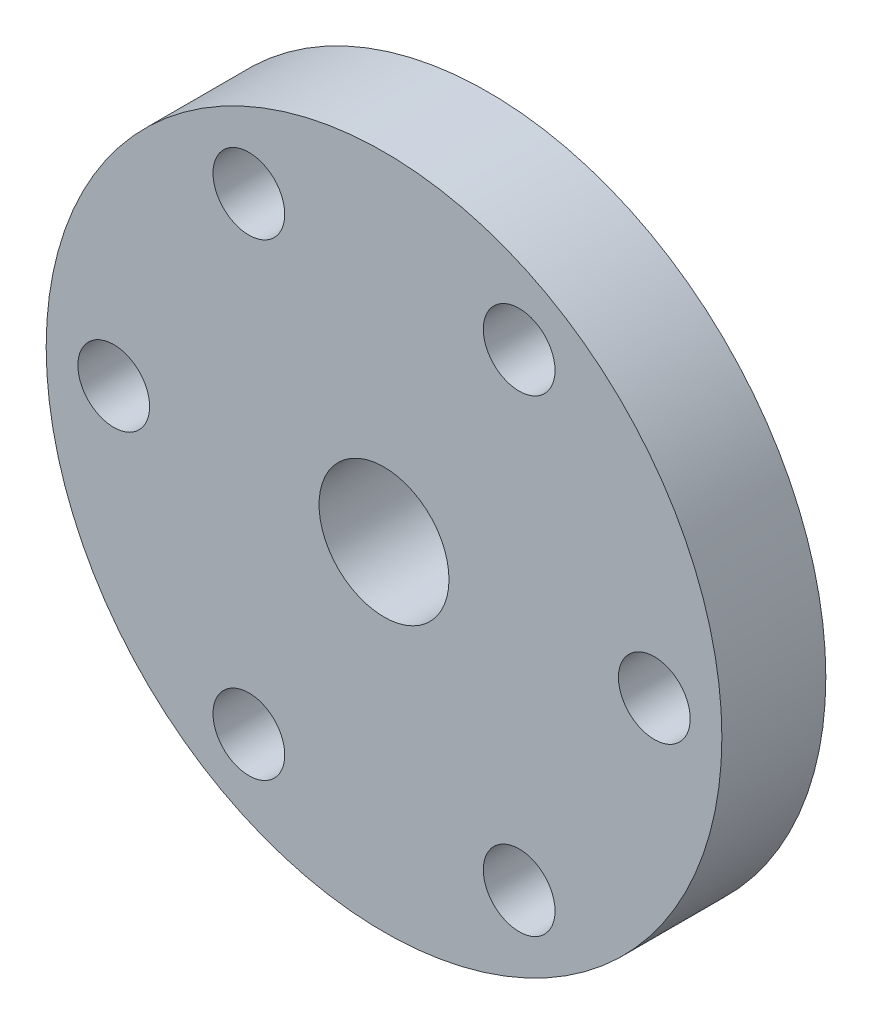
ISO-10303-21;
HEADER;
FILE_DESCRIPTION(('STEP AP214'),'2;1');
FILE_NAME('part.step','',(''),(''),'','','');
FILE_SCHEMA(('AUTOMOTIVE_DESIGN { 1 0 10303 214 1 1 1 1 }'));
ENDSEC;
DATA;
#1=APPLICATION_CONTEXT('core data for automotive mechanical design processes');
#2=APPLICATION_PROTOCOL_DEFINITION('international standard','automotive_design',2000,#1);
#3=PRODUCT_CONTEXT('',#1,'mechanical');
#4=PRODUCT('Part','Part','',(#3));
#5=PRODUCT_RELATED_PRODUCT_CATEGORY('part','',(#4));
#6=PRODUCT_DEFINITION_FORMATION('','',#4);
#7=PRODUCT_DEFINITION_CONTEXT('part definition',#1,'design');
#8=PRODUCT_DEFINITION('design','',#6,#7);
#9=PRODUCT_DEFINITION_SHAPE('','',#8);
#10=(LENGTH_UNIT() NAMED_UNIT(*) SI_UNIT(.MILLI.,.METRE.));
#11=(NAMED_UNIT(*) PLANE_ANGLE_UNIT() SI_UNIT($,.RADIAN.));
#12=(NAMED_UNIT(*) SI_UNIT($,.STERADIAN.) SOLID_ANGLE_UNIT());
#13=UNCERTAINTY_MEASURE_WITH_UNIT(LENGTH_MEASURE(1.E-05),#10,'distance_accuracy_value','');
#14=(GEOMETRIC_REPRESENTATION_CONTEXT(3) GLOBAL_UNCERTAINTY_ASSIGNED_CONTEXT((#13)) GLOBAL_UNIT_ASSIGNED_CONTEXT((#10,
#11,#12)) REPRESENTATION_CONTEXT('',''));
#15=CARTESIAN_POINT('',(0.,0.,0.));
#16=DIRECTION('',(0.,0.,1.));
#17=DIRECTION('',(1.,0.,0.));
#18=AXIS2_PLACEMENT_3D('',#15,#16,#17);
#19=CARTESIAN_POINT('',(0.,0.,5.08));
#20=DIRECTION('',(0.,0.,-1.));
#21=DIRECTION('',(-1.,0.,0.));
#22=AXIS2_PLACEMENT_3D('',#19,#20,#21);
#23=CYLINDRICAL_SURFACE('',#22,16.51);
#24=CARTESIAN_POINT('',(0.,0.,5.08));
#25=DIRECTION('',(0.,0.,1.));
#26=DIRECTION('',(1.,0.,0.));
#27=AXIS2_PLACEMENT_3D('',#24,#25,#26);
#28=CIRCLE('',#27,16.51);
#29=CARTESIAN_POINT('',(16.51,0.,5.08));
#30=VERTEX_POINT('',#29);
#31=EDGE_CURVE('E10',#30,#30,#28,.T.);
#32=ORIENTED_EDGE('',*,*,#31,.F.);
#33=EDGE_LOOP('',(#32));
#34=FACE_BOUND('',#33,.T.);
#35=CARTESIAN_POINT('',(0.,0.,0.));
#36=DIRECTION('',(0.,0.,1.));
#37=DIRECTION('',(1.,0.,0.));
#38=AXIS2_PLACEMENT_3D('',#35,#36,#37);
#39=CIRCLE('',#38,16.51);
#40=CARTESIAN_POINT('',(16.51,0.,0.));
#41=VERTEX_POINT('',#40);
#42=EDGE_CURVE('E33',#41,#41,#39,.T.);
#43=ORIENTED_EDGE('',*,*,#42,.T.);
#44=EDGE_LOOP('',(#43));
#45=FACE_BOUND('',#44,.T.);
#46=ADVANCED_FACE('F30',(#34,#45),#23,.T.);
#47=CARTESIAN_POINT('',(0.,0.,5.08));
#48=DIRECTION('',(0.,0.,1.));
#49=DIRECTION('',(1.,0.,0.));
#50=AXIS2_PLACEMENT_3D('',#47,#48,#49);
#51=PLANE('',#50);
#52=CARTESIAN_POINT('',(-6.60400000000013,11.4384635331848,5.08));
#53=DIRECTION('',(0.,0.,1.));
#54=DIRECTION('',(0.50000000000001,-0.866025403784433,0.));
#55=AXIS2_PLACEMENT_3D('',#52,#53,#54);
#56=CIRCLE('',#55,1.7526);
#57=CARTESIAN_POINT('',(-5.72770000000012,9.92066741051219,5.08));
#58=VERTEX_POINT('',#57);
#59=EDGE_CURVE('E78',#58,#58,#56,.T.);
#60=ORIENTED_EDGE('',*,*,#59,.F.);
#61=EDGE_LOOP('',(#60));
#62=FACE_BOUND('',#61,.T.);
#63=CARTESIAN_POINT('',(6.60399999999989,11.4384635331849,5.08));
#64=DIRECTION('',(0.,0.,1.));
#65=DIRECTION('',(-0.499999999999992,-0.866025403784443,0.));
#66=AXIS2_PLACEMENT_3D('',#63,#64,#65);
#67=CIRCLE('',#66,1.7526);
#68=CARTESIAN_POINT('',(5.72769999999991,9.92066741051231,5.08));
#69=VERTEX_POINT('',#68);
#70=EDGE_CURVE('E72',#69,#69,#67,.T.);
#71=ORIENTED_EDGE('',*,*,#70,.F.);
#72=EDGE_LOOP('',(#71));
#73=FACE_BOUND('',#72,.T.);
#74=CARTESIAN_POINT('',(13.208,0.,5.08));
#75=DIRECTION('',(0.,0.,1.));
#76=DIRECTION('',(-1.,0.,0.));
#77=AXIS2_PLACEMENT_3D('',#74,#75,#76);
#78=CIRCLE('',#77,1.7526);
#79=CARTESIAN_POINT('',(11.4554,0.,5.08));
#80=VERTEX_POINT('',#79);
#81=EDGE_CURVE('E66',#80,#80,#78,.T.);
#82=ORIENTED_EDGE('',*,*,#81,.F.);
#83=EDGE_LOOP('',(#82));
#84=FACE_BOUND('',#83,.T.);
#85=CARTESIAN_POINT('',(6.60400000000005,-11.4384635331848,5.08));
#86=DIRECTION('',(0.,0.,1.));
#87=DIRECTION('',(-0.500000000000004,0.866025403784436,0.));
#88=AXIS2_PLACEMENT_3D('',#85,#86,#87);
#89=CIRCLE('',#88,1.7526);
#90=CARTESIAN_POINT('',(5.72770000000005,-9.92066741051223,5.08));
#91=VERTEX_POINT('',#90);
#92=EDGE_CURVE('E60',#91,#91,#89,.T.);
#93=ORIENTED_EDGE('',*,*,#92,.F.);
#94=EDGE_LOOP('',(#93));
#95=FACE_BOUND('',#94,.T.);
#96=CARTESIAN_POINT('',(-6.60399999999997,-11.4384635331849,5.08));
#97=DIRECTION('',(0.,0.,1.));
#98=DIRECTION('',(0.499999999999998,0.86602540378444,0.));
#99=AXIS2_PLACEMENT_3D('',#96,#97,#98);
#100=CIRCLE('',#99,1.7526);
#101=CARTESIAN_POINT('',(-5.72769999999998,-9.92066741051227,5.08));
#102=VERTEX_POINT('',#101);
#103=EDGE_CURVE('E54',#102,#102,#100,.T.);
#104=ORIENTED_EDGE('',*,*,#103,.F.);
#105=EDGE_LOOP('',(#104));
#106=FACE_BOUND('',#105,.T.);
#107=CARTESIAN_POINT('',(-13.208,0.,5.08));
#108=DIRECTION('',(0.,0.,1.));
#109=DIRECTION('',(1.,0.,0.));
#110=AXIS2_PLACEMENT_3D('',#107,#108,#109);
#111=CIRCLE('',#110,1.7526);
#112=CARTESIAN_POINT('',(-11.4554,0.,5.08));
#113=VERTEX_POINT('',#112);
#114=EDGE_CURVE('E48',#113,#113,#111,.T.);
#115=ORIENTED_EDGE('',*,*,#114,.F.);
#116=EDGE_LOOP('',(#115));
#117=FACE_BOUND('',#116,.T.);
#118=CARTESIAN_POINT('',(0.,0.,5.08));
#119=DIRECTION('',(0.,0.,1.));
#120=DIRECTION('',(1.,0.,0.));
#121=AXIS2_PLACEMENT_3D('',#118,#119,#120);
#122=CIRCLE('',#121,3.175);
#123=CARTESIAN_POINT('',(3.175,0.,5.08));
#124=VERTEX_POINT('',#123);
#125=EDGE_CURVE('E42',#124,#124,#122,.T.);
#126=ORIENTED_EDGE('',*,*,#125,.F.);
#127=EDGE_LOOP('',(#126));
#128=FACE_BOUND('',#127,.T.);
#129=ORIENTED_EDGE('',*,*,#31,.T.);
#130=EDGE_LOOP('',(#129));
#131=FACE_BOUND('',#130,.T.);
#132=ADVANCED_FACE('F94',(#62,#73,#84,#95,#106,#117,#128,#131),#51,.T.);
#133=CARTESIAN_POINT('',(0.,0.,0.));
#134=DIRECTION('',(0.,0.,1.));
#135=DIRECTION('',(1.,0.,0.));
#136=AXIS2_PLACEMENT_3D('',#133,#134,#135);
#137=PLANE('',#136);
#138=CARTESIAN_POINT('',(-6.60400000000013,11.4384635331848,0.));
#139=DIRECTION('',(0.,0.,1.));
#140=DIRECTION('',(0.50000000000001,-0.866025403784433,0.));
#141=AXIS2_PLACEMENT_3D('',#138,#139,#140);
#142=CIRCLE('',#141,1.7526);
#143=CARTESIAN_POINT('',(-5.72770000000012,9.92066741051219,0.));
#144=VERTEX_POINT('',#143);
#145=EDGE_CURVE('E75',#144,#144,#142,.T.);
#146=ORIENTED_EDGE('',*,*,#145,.T.);
#147=EDGE_LOOP('',(#146));
#148=FACE_BOUND('',#147,.T.);
#149=CARTESIAN_POINT('',(6.60399999999989,11.4384635331849,0.));
#150=DIRECTION('',(0.,0.,1.));
#151=DIRECTION('',(-0.499999999999992,-0.866025403784443,0.));
#152=AXIS2_PLACEMENT_3D('',#149,#150,#151);
#153=CIRCLE('',#152,1.7526);
#154=CARTESIAN_POINT('',(5.72769999999991,9.92066741051231,0.));
#155=VERTEX_POINT('',#154);
#156=EDGE_CURVE('E69',#155,#155,#153,.T.);
#157=ORIENTED_EDGE('',*,*,#156,.T.);
#158=EDGE_LOOP('',(#157));
#159=FACE_BOUND('',#158,.T.);
#160=CARTESIAN_POINT('',(13.208,0.,0.));
#161=DIRECTION('',(0.,0.,1.));
#162=DIRECTION('',(-1.,0.,0.));
#163=AXIS2_PLACEMENT_3D('',#160,#161,#162);
#164=CIRCLE('',#163,1.7526);
#165=CARTESIAN_POINT('',(11.4554,0.,0.));
#166=VERTEX_POINT('',#165);
#167=EDGE_CURVE('E63',#166,#166,#164,.T.);
#168=ORIENTED_EDGE('',*,*,#167,.T.);
#169=EDGE_LOOP('',(#168));
#170=FACE_BOUND('',#169,.T.);
#171=CARTESIAN_POINT('',(6.60400000000005,-11.4384635331848,0.));
#172=DIRECTION('',(0.,0.,1.));
#173=DIRECTION('',(-0.500000000000004,0.866025403784436,0.));
#174=AXIS2_PLACEMENT_3D('',#171,#172,#173);
#175=CIRCLE('',#174,1.7526);
#176=CARTESIAN_POINT('',(5.72770000000005,-9.92066741051223,0.));
#177=VERTEX_POINT('',#176);
#178=EDGE_CURVE('E57',#177,#177,#175,.T.);
#179=ORIENTED_EDGE('',*,*,#178,.T.);
#180=EDGE_LOOP('',(#179));
#181=FACE_BOUND('',#180,.T.);
#182=CARTESIAN_POINT('',(-6.60399999999997,-11.4384635331849,0.));
#183=DIRECTION('',(0.,0.,1.));
#184=DIRECTION('',(0.499999999999998,0.86602540378444,0.));
#185=AXIS2_PLACEMENT_3D('',#182,#183,#184);
#186=CIRCLE('',#185,1.7526);
#187=CARTESIAN_POINT('',(-5.72769999999998,-9.92066741051227,0.));
#188=VERTEX_POINT('',#187);
#189=EDGE_CURVE('E51',#188,#188,#186,.T.);
#190=ORIENTED_EDGE('',*,*,#189,.T.);
#191=EDGE_LOOP('',(#190));
#192=FACE_BOUND('',#191,.T.);
#193=CARTESIAN_POINT('',(-13.208,0.,0.));
#194=DIRECTION('',(0.,0.,1.));
#195=DIRECTION('',(1.,0.,0.));
#196=AXIS2_PLACEMENT_3D('',#193,#194,#195);
#197=CIRCLE('',#196,1.7526);
#198=CARTESIAN_POINT('',(-11.4554,0.,0.));
#199=VERTEX_POINT('',#198);
#200=EDGE_CURVE('E45',#199,#199,#197,.T.);
#201=ORIENTED_EDGE('',*,*,#200,.T.);
#202=EDGE_LOOP('',(#201));
#203=FACE_BOUND('',#202,.T.);
#204=CARTESIAN_POINT('',(0.,0.,0.));
#205=DIRECTION('',(0.,0.,1.));
#206=DIRECTION('',(1.,0.,0.));
#207=AXIS2_PLACEMENT_3D('',#204,#205,#206);
#208=CIRCLE('',#207,3.175);
#209=CARTESIAN_POINT('',(3.175,0.,0.));
#210=VERTEX_POINT('',#209);
#211=EDGE_CURVE('E40',#210,#210,#208,.T.);
#212=ORIENTED_EDGE('',*,*,#211,.T.);
#213=EDGE_LOOP('',(#212));
#214=FACE_BOUND('',#213,.T.);
#215=ORIENTED_EDGE('',*,*,#42,.F.);
#216=EDGE_LOOP('',(#215));
#217=FACE_BOUND('',#216,.T.);
#218=ADVANCED_FACE('F84',(#148,#159,#170,#181,#192,#203,#214,#217),#137,.F.);
#219=CARTESIAN_POINT('',(0.,0.,0.));
#220=DIRECTION('',(0.,0.,1.));
#221=DIRECTION('',(1.,0.,0.));
#222=AXIS2_PLACEMENT_3D('',#219,#220,#221);
#223=CYLINDRICAL_SURFACE('',#222,3.175);
#224=ORIENTED_EDGE('',*,*,#211,.F.);
#225=EDGE_LOOP('',(#224));
#226=FACE_BOUND('',#225,.T.);
#227=ORIENTED_EDGE('',*,*,#125,.T.);
#228=EDGE_LOOP('',(#227));
#229=FACE_BOUND('',#228,.T.);
#230=ADVANCED_FACE('F110',(#226,#229),#223,.F.);
#231=CARTESIAN_POINT('',(-13.208,0.,0.));
#232=DIRECTION('',(0.,0.,1.));
#233=DIRECTION('',(1.,0.,0.));
#234=AXIS2_PLACEMENT_3D('',#231,#232,#233);
#235=CYLINDRICAL_SURFACE('',#234,1.7526);
#236=ORIENTED_EDGE('',*,*,#200,.F.);
#237=EDGE_LOOP('',(#236));
#238=FACE_BOUND('',#237,.T.);
#239=ORIENTED_EDGE('',*,*,#114,.T.);
#240=EDGE_LOOP('',(#239));
#241=FACE_BOUND('',#240,.T.);
#242=ADVANCED_FACE('F112',(#238,#241),#235,.F.);
#243=CARTESIAN_POINT('',(-6.60399999999997,-11.4384635331849,0.));
#244=DIRECTION('',(0.,0.,1.));
#245=DIRECTION('',(1.,0.,0.));
#246=AXIS2_PLACEMENT_3D('',#243,#244,#245);
#247=CYLINDRICAL_SURFACE('',#246,1.7526);
#248=ORIENTED_EDGE('',*,*,#189,.F.);
#249=EDGE_LOOP('',(#248));
#250=FACE_BOUND('',#249,.T.);
#251=ORIENTED_EDGE('',*,*,#103,.T.);
#252=EDGE_LOOP('',(#251));
#253=FACE_BOUND('',#252,.T.);
#254=ADVANCED_FACE('F119',(#250,#253),#247,.F.);
#255=CARTESIAN_POINT('',(6.60400000000005,-11.4384635331848,0.));
#256=DIRECTION('',(0.,0.,1.));
#257=DIRECTION('',(1.,0.,0.));
#258=AXIS2_PLACEMENT_3D('',#255,#256,#257);
#259=CYLINDRICAL_SURFACE('',#258,1.7526);
#260=ORIENTED_EDGE('',*,*,#178,.F.);
#261=EDGE_LOOP('',(#260));
#262=FACE_BOUND('',#261,.T.);
#263=ORIENTED_EDGE('',*,*,#92,.T.);
#264=EDGE_LOOP('',(#263));
#265=FACE_BOUND('',#264,.T.);
#266=ADVANCED_FACE('F157',(#262,#265),#259,.F.);
#267=CARTESIAN_POINT('',(13.208,0.,0.));
#268=DIRECTION('',(0.,0.,1.));
#269=DIRECTION('',(1.,0.,0.));
#270=AXIS2_PLACEMENT_3D('',#267,#268,#269);
#271=CYLINDRICAL_SURFACE('',#270,1.7526);
#272=ORIENTED_EDGE('',*,*,#167,.F.);
#273=EDGE_LOOP('',(#272));
#274=FACE_BOUND('',#273,.T.);
#275=ORIENTED_EDGE('',*,*,#81,.T.);
#276=EDGE_LOOP('',(#275));
#277=FACE_BOUND('',#276,.T.);
#278=ADVANCED_FACE('F167',(#274,#277),#271,.F.);
#279=CARTESIAN_POINT('',(6.60399999999989,11.4384635331849,0.));
#280=DIRECTION('',(0.,0.,1.));
#281=DIRECTION('',(1.,0.,0.));
#282=AXIS2_PLACEMENT_3D('',#279,#280,#281);
#283=CYLINDRICAL_SURFACE('',#282,1.7526);
#284=ORIENTED_EDGE('',*,*,#156,.F.);
#285=EDGE_LOOP('',(#284));
#286=FACE_BOUND('',#285,.T.);
#287=ORIENTED_EDGE('',*,*,#70,.T.);
#288=EDGE_LOOP('',(#287));
#289=FACE_BOUND('',#288,.T.);
#290=ADVANCED_FACE('F90',(#286,#289),#283,.F.);
#291=CARTESIAN_POINT('',(-6.60400000000013,11.4384635331848,0.));
#292=DIRECTION('',(0.,0.,1.));
#293=DIRECTION('',(1.,0.,0.));
#294=AXIS2_PLACEMENT_3D('',#291,#292,#293);
#295=CYLINDRICAL_SURFACE('',#294,1.7526);
#296=ORIENTED_EDGE('',*,*,#145,.F.);
#297=EDGE_LOOP('',(#296));
#298=FACE_BOUND('',#297,.T.);
#299=ORIENTED_EDGE('',*,*,#59,.T.);
#300=EDGE_LOOP('',(#299));
#301=FACE_BOUND('',#300,.T.);
#302=ADVANCED_FACE('F87',(#298,#301),#295,.F.);
#303=CLOSED_SHELL('',(#46,#132,#218,#230,#242,#254,#266,#278,#290,#302));
#304=MANIFOLD_SOLID_BREP('B2',#303);
#305=ADVANCED_BREP_SHAPE_REPRESENTATION('',(#18,#304),#14);
#306=SHAPE_DEFINITION_REPRESENTATION(#9,#305);
ENDSEC;
END-ISO-10303-21;
